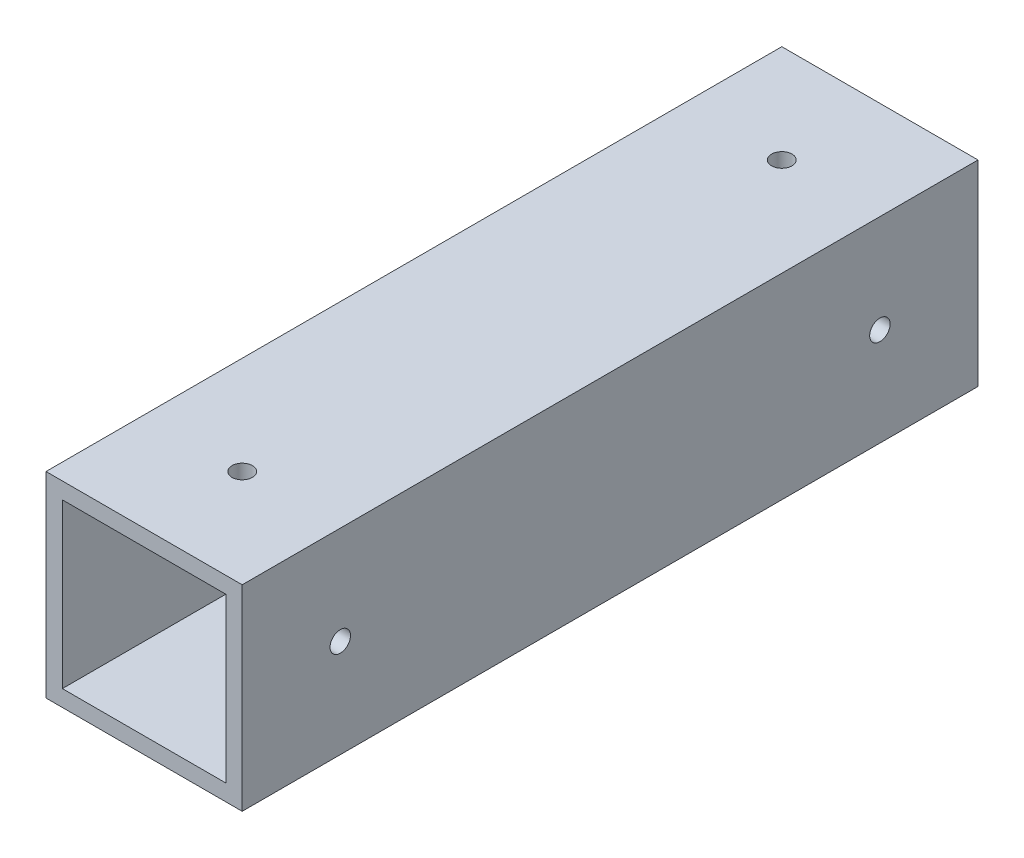
ISO-10303-21;
HEADER;
FILE_DESCRIPTION(('STEP AP214'),'2;1');
FILE_NAME('part.step','',(''),(''),'','','');
FILE_SCHEMA(('AUTOMOTIVE_DESIGN { 1 0 10303 214 1 1 1 1 }'));
ENDSEC;
DATA;
#1=APPLICATION_CONTEXT('core data for automotive mechanical design processes');
#2=APPLICATION_PROTOCOL_DEFINITION('international standard','automotive_design',2000,#1);
#3=PRODUCT_CONTEXT('',#1,'mechanical');
#4=PRODUCT('Part','Part','',(#3));
#5=PRODUCT_RELATED_PRODUCT_CATEGORY('part','',(#4));
#6=PRODUCT_DEFINITION_FORMATION('','',#4);
#7=PRODUCT_DEFINITION_CONTEXT('part definition',#1,'design');
#8=PRODUCT_DEFINITION('design','',#6,#7);
#9=PRODUCT_DEFINITION_SHAPE('','',#8);
#10=(LENGTH_UNIT() NAMED_UNIT(*) SI_UNIT(.MILLI.,.METRE.));
#11=(NAMED_UNIT(*) PLANE_ANGLE_UNIT() SI_UNIT($,.RADIAN.));
#12=(NAMED_UNIT(*) SI_UNIT($,.STERADIAN.) SOLID_ANGLE_UNIT());
#13=UNCERTAINTY_MEASURE_WITH_UNIT(LENGTH_MEASURE(1.E-05),#10,'distance_accuracy_value','');
#14=(GEOMETRIC_REPRESENTATION_CONTEXT(3) GLOBAL_UNCERTAINTY_ASSIGNED_CONTEXT((#13)) GLOBAL_UNIT_ASSIGNED_CONTEXT((#10,
#11,#12)) REPRESENTATION_CONTEXT('',''));
#15=CARTESIAN_POINT('',(0.,0.,0.));
#16=DIRECTION('',(0.,0.,1.));
#17=DIRECTION('',(1.,0.,0.));
#18=AXIS2_PLACEMENT_3D('',#15,#16,#17);
#19=CARTESIAN_POINT('',(0.,0.,45.005));
#20=DIRECTION('',(0.,0.,1.));
#21=DIRECTION('',(1.,0.,0.));
#22=AXIS2_PLACEMENT_3D('',#19,#20,#21);
#23=PLANE('',#22);
#24=DIRECTION('',(0.,-1.,0.));
#25=VECTOR('',#24,1.);
#26=CARTESIAN_POINT('',(-12.,12.,45.005));
#27=LINE('',#26,#25);
#28=CARTESIAN_POINT('',(-12.,12.,45.005));
#29=VERTEX_POINT('',#28);
#30=CARTESIAN_POINT('',(-12.,-12.,45.005));
#31=VERTEX_POINT('',#30);
#32=EDGE_CURVE('E142',#29,#31,#27,.T.);
#33=ORIENTED_EDGE('',*,*,#32,.T.);
#34=DIRECTION('',(1.,0.,0.));
#35=VECTOR('',#34,1.);
#36=CARTESIAN_POINT('',(-12.,-12.,45.005));
#37=LINE('',#36,#35);
#38=CARTESIAN_POINT('',(12.,-12.,45.005));
#39=VERTEX_POINT('',#38);
#40=EDGE_CURVE('E145',#31,#39,#37,.T.);
#41=ORIENTED_EDGE('',*,*,#40,.T.);
#42=DIRECTION('',(0.,1.,0.));
#43=VECTOR('',#42,1.);
#44=CARTESIAN_POINT('',(12.,12.,45.005));
#45=LINE('',#44,#43);
#46=CARTESIAN_POINT('',(12.,12.,45.005));
#47=VERTEX_POINT('',#46);
#48=EDGE_CURVE('E148',#39,#47,#45,.T.);
#49=ORIENTED_EDGE('',*,*,#48,.T.);
#50=DIRECTION('',(-1.,0.,0.));
#51=VECTOR('',#50,1.);
#52=CARTESIAN_POINT('',(-12.,12.,45.005));
#53=LINE('',#52,#51);
#54=EDGE_CURVE('E150',#47,#29,#53,.T.);
#55=ORIENTED_EDGE('',*,*,#54,.T.);
#56=EDGE_LOOP('',(#33,#41,#49,#55));
#57=FACE_BOUND('',#56,.T.);
#58=DIRECTION('',(-1.,0.,0.));
#59=VECTOR('',#58,1.);
#60=CARTESIAN_POINT('',(-10.,10.,45.005));
#61=LINE('',#60,#59);
#62=CARTESIAN_POINT('',(10.,10.,45.005));
#63=VERTEX_POINT('',#62);
#64=CARTESIAN_POINT('',(-10.,10.,45.005));
#65=VERTEX_POINT('',#64);
#66=EDGE_CURVE('E112',#63,#65,#61,.T.);
#67=ORIENTED_EDGE('',*,*,#66,.F.);
#68=DIRECTION('',(0.,1.,0.));
#69=VECTOR('',#68,1.);
#70=CARTESIAN_POINT('',(10.,10.,45.005));
#71=LINE('',#70,#69);
#72=CARTESIAN_POINT('',(10.,-10.,45.005));
#73=VERTEX_POINT('',#72);
#74=EDGE_CURVE('E104',#73,#63,#71,.T.);
#75=ORIENTED_EDGE('',*,*,#74,.F.);
#76=DIRECTION('',(1.,0.,0.));
#77=VECTOR('',#76,1.);
#78=CARTESIAN_POINT('',(-10.,-10.,45.005));
#79=LINE('',#78,#77);
#80=CARTESIAN_POINT('',(-10.,-10.,45.005));
#81=VERTEX_POINT('',#80);
#82=EDGE_CURVE('E126',#81,#73,#79,.T.);
#83=ORIENTED_EDGE('',*,*,#82,.F.);
#84=DIRECTION('',(0.,-1.,0.));
#85=VECTOR('',#84,1.);
#86=CARTESIAN_POINT('',(-10.,10.,45.005));
#87=LINE('',#86,#85);
#88=EDGE_CURVE('E124',#65,#81,#87,.T.);
#89=ORIENTED_EDGE('',*,*,#88,.F.);
#90=EDGE_LOOP('',(#67,#75,#83,#89));
#91=FACE_BOUND('',#90,.T.);
#92=ADVANCED_FACE('F37',(#57,#91),#23,.T.);
#93=CARTESIAN_POINT('',(0.,0.,-45.005));
#94=DIRECTION('',(0.,0.,1.));
#95=DIRECTION('',(1.,0.,0.));
#96=AXIS2_PLACEMENT_3D('',#93,#94,#95);
#97=PLANE('',#96);
#98=DIRECTION('',(0.,-1.,0.));
#99=VECTOR('',#98,1.);
#100=CARTESIAN_POINT('',(-12.,12.,-45.005));
#101=LINE('',#100,#99);
#102=CARTESIAN_POINT('',(-12.,12.,-45.005));
#103=VERTEX_POINT('',#102);
#104=CARTESIAN_POINT('',(-12.,-12.,-45.005));
#105=VERTEX_POINT('',#104);
#106=EDGE_CURVE('E120',#103,#105,#101,.T.);
#107=ORIENTED_EDGE('',*,*,#106,.F.);
#108=DIRECTION('',(-1.,0.,0.));
#109=VECTOR('',#108,1.);
#110=CARTESIAN_POINT('',(-12.,12.,-45.005));
#111=LINE('',#110,#109);
#112=CARTESIAN_POINT('',(12.,12.,-45.005));
#113=VERTEX_POINT('',#112);
#114=EDGE_CURVE('E146',#113,#103,#111,.T.);
#115=ORIENTED_EDGE('',*,*,#114,.F.);
#116=DIRECTION('',(0.,1.,0.));
#117=VECTOR('',#116,1.);
#118=CARTESIAN_POINT('',(12.,12.,-45.005));
#119=LINE('',#118,#117);
#120=CARTESIAN_POINT('',(12.,-12.,-45.005));
#121=VERTEX_POINT('',#120);
#122=EDGE_CURVE('E157',#121,#113,#119,.T.);
#123=ORIENTED_EDGE('',*,*,#122,.F.);
#124=DIRECTION('',(1.,0.,0.));
#125=VECTOR('',#124,1.);
#126=CARTESIAN_POINT('',(-12.,-12.,-45.005));
#127=LINE('',#126,#125);
#128=EDGE_CURVE('E155',#105,#121,#127,.T.);
#129=ORIENTED_EDGE('',*,*,#128,.F.);
#130=EDGE_LOOP('',(#107,#115,#123,#129));
#131=FACE_BOUND('',#130,.T.);
#132=DIRECTION('',(0.,1.,0.));
#133=VECTOR('',#132,1.);
#134=CARTESIAN_POINT('',(10.,10.,-45.005));
#135=LINE('',#134,#133);
#136=CARTESIAN_POINT('',(10.,-10.,-45.005));
#137=VERTEX_POINT('',#136);
#138=CARTESIAN_POINT('',(10.,10.,-45.005));
#139=VERTEX_POINT('',#138);
#140=EDGE_CURVE('E62',#137,#139,#135,.T.);
#141=ORIENTED_EDGE('',*,*,#140,.T.);
#142=DIRECTION('',(-1.,0.,0.));
#143=VECTOR('',#142,1.);
#144=CARTESIAN_POINT('',(-10.,10.,-45.005));
#145=LINE('',#144,#143);
#146=CARTESIAN_POINT('',(-10.,10.,-45.005));
#147=VERTEX_POINT('',#146);
#148=EDGE_CURVE('E119',#139,#147,#145,.T.);
#149=ORIENTED_EDGE('',*,*,#148,.T.);
#150=DIRECTION('',(0.,-1.,0.));
#151=VECTOR('',#150,1.);
#152=CARTESIAN_POINT('',(-10.,10.,-45.005));
#153=LINE('',#152,#151);
#154=CARTESIAN_POINT('',(-10.,-10.,-45.005));
#155=VERTEX_POINT('',#154);
#156=EDGE_CURVE('E134',#147,#155,#153,.T.);
#157=ORIENTED_EDGE('',*,*,#156,.T.);
#158=DIRECTION('',(1.,0.,0.));
#159=VECTOR('',#158,1.);
#160=CARTESIAN_POINT('',(-10.,-10.,-45.005));
#161=LINE('',#160,#159);
#162=EDGE_CURVE('E113',#155,#137,#161,.T.);
#163=ORIENTED_EDGE('',*,*,#162,.T.);
#164=EDGE_LOOP('',(#141,#149,#157,#163));
#165=FACE_BOUND('',#164,.T.);
#166=ADVANCED_FACE('F229',(#131,#165),#97,.F.);
#167=CARTESIAN_POINT('',(-12.,12.,45.005));
#168=DIRECTION('',(1.,0.,0.));
#169=DIRECTION('',(0.,1.,0.));
#170=AXIS2_PLACEMENT_3D('',#167,#168,#169);
#171=PLANE('',#170);
#172=CARTESIAN_POINT('',(-12.,0.,33.005));
#173=DIRECTION('',(-1.,0.,0.));
#174=DIRECTION('',(0.,0.,1.));
#175=AXIS2_PLACEMENT_3D('',#172,#173,#174);
#176=CIRCLE('',#175,1.25);
#177=CARTESIAN_POINT('',(-12.,0.,34.255));
#178=VERTEX_POINT('',#177);
#179=EDGE_CURVE('E182',#178,#178,#176,.T.);
#180=ORIENTED_EDGE('',*,*,#179,.F.);
#181=EDGE_LOOP('',(#180));
#182=FACE_BOUND('',#181,.T.);
#183=CARTESIAN_POINT('',(-12.,0.,-33.005));
#184=DIRECTION('',(-1.,0.,0.));
#185=DIRECTION('',(0.,0.,1.));
#186=AXIS2_PLACEMENT_3D('',#183,#184,#185);
#187=CIRCLE('',#186,1.25);
#188=CARTESIAN_POINT('',(-12.,0.,-31.755));
#189=VERTEX_POINT('',#188);
#190=EDGE_CURVE('E200',#189,#189,#187,.T.);
#191=ORIENTED_EDGE('',*,*,#190,.F.);
#192=EDGE_LOOP('',(#191));
#193=FACE_BOUND('',#192,.T.);
#194=ORIENTED_EDGE('',*,*,#106,.T.);
#195=DIRECTION('',(0.,0.,-1.));
#196=VECTOR('',#195,1.);
#197=CARTESIAN_POINT('',(-12.,-12.,45.005));
#198=LINE('',#197,#196);
#199=EDGE_CURVE('E11',#31,#105,#198,.T.);
#200=ORIENTED_EDGE('',*,*,#199,.F.);
#201=ORIENTED_EDGE('',*,*,#32,.F.);
#202=DIRECTION('',(0.,0.,-1.));
#203=VECTOR('',#202,1.);
#204=CARTESIAN_POINT('',(-12.,12.,45.005));
#205=LINE('',#204,#203);
#206=EDGE_CURVE('E152',#29,#103,#205,.T.);
#207=ORIENTED_EDGE('',*,*,#206,.T.);
#208=EDGE_LOOP('',(#194,#200,#201,#207));
#209=FACE_BOUND('',#208,.T.);
#210=ADVANCED_FACE('F39',(#182,#193,#209),#171,.F.);
#211=CARTESIAN_POINT('',(-12.,-12.,45.005));
#212=DIRECTION('',(0.,1.,0.));
#213=DIRECTION('',(-1.,0.,0.));
#214=AXIS2_PLACEMENT_3D('',#211,#212,#213);
#215=PLANE('',#214);
#216=CARTESIAN_POINT('',(0.,-12.,33.005));
#217=DIRECTION('',(0.,1.,0.));
#218=DIRECTION('',(0.,0.,1.));
#219=AXIS2_PLACEMENT_3D('',#216,#217,#218);
#220=CIRCLE('',#219,1.24999999999998);
#221=CARTESIAN_POINT('',(0.,-12.,34.255));
#222=VERTEX_POINT('',#221);
#223=EDGE_CURVE('E248',#222,#222,#220,.T.);
#224=ORIENTED_EDGE('',*,*,#223,.T.);
#225=EDGE_LOOP('',(#224));
#226=FACE_BOUND('',#225,.T.);
#227=CARTESIAN_POINT('',(0.,-12.,-33.005));
#228=DIRECTION('',(0.,1.,0.));
#229=DIRECTION('',(0.,0.,1.));
#230=AXIS2_PLACEMENT_3D('',#227,#228,#229);
#231=CIRCLE('',#230,1.24999999999998);
#232=CARTESIAN_POINT('',(0.,-12.,-31.755));
#233=VERTEX_POINT('',#232);
#234=EDGE_CURVE('E178',#233,#233,#231,.T.);
#235=ORIENTED_EDGE('',*,*,#234,.T.);
#236=EDGE_LOOP('',(#235));
#237=FACE_BOUND('',#236,.T.);
#238=ORIENTED_EDGE('',*,*,#128,.T.);
#239=DIRECTION('',(0.,0.,-1.));
#240=VECTOR('',#239,1.);
#241=CARTESIAN_POINT('',(12.,-12.,45.005));
#242=LINE('',#241,#240);
#243=EDGE_CURVE('E46',#39,#121,#242,.T.);
#244=ORIENTED_EDGE('',*,*,#243,.F.);
#245=ORIENTED_EDGE('',*,*,#40,.F.);
#246=ORIENTED_EDGE('',*,*,#199,.T.);
#247=EDGE_LOOP('',(#238,#244,#245,#246));
#248=FACE_BOUND('',#247,.T.);
#249=ADVANCED_FACE('F237',(#226,#237,#248),#215,.F.);
#250=CARTESIAN_POINT('',(12.,12.,45.005));
#251=DIRECTION('',(-1.,0.,0.));
#252=DIRECTION('',(0.,-1.,0.));
#253=AXIS2_PLACEMENT_3D('',#250,#251,#252);
#254=PLANE('',#253);
#255=CARTESIAN_POINT('',(12.,0.,33.005));
#256=DIRECTION('',(-1.,0.,0.));
#257=DIRECTION('',(0.,0.,1.));
#258=AXIS2_PLACEMENT_3D('',#255,#256,#257);
#259=CIRCLE('',#258,1.24999999999999);
#260=CARTESIAN_POINT('',(12.,0.,34.255));
#261=VERTEX_POINT('',#260);
#262=EDGE_CURVE('E174',#261,#261,#259,.T.);
#263=ORIENTED_EDGE('',*,*,#262,.T.);
#264=EDGE_LOOP('',(#263));
#265=FACE_BOUND('',#264,.T.);
#266=CARTESIAN_POINT('',(12.,0.,-33.005));
#267=DIRECTION('',(-1.,0.,0.));
#268=DIRECTION('',(0.,0.,1.));
#269=AXIS2_PLACEMENT_3D('',#266,#267,#268);
#270=CIRCLE('',#269,1.24999999999999);
#271=CARTESIAN_POINT('',(12.,0.,-31.755));
#272=VERTEX_POINT('',#271);
#273=EDGE_CURVE('E170',#272,#272,#270,.T.);
#274=ORIENTED_EDGE('',*,*,#273,.T.);
#275=EDGE_LOOP('',(#274));
#276=FACE_BOUND('',#275,.T.);
#277=ORIENTED_EDGE('',*,*,#122,.T.);
#278=DIRECTION('',(0.,0.,-1.));
#279=VECTOR('',#278,1.);
#280=CARTESIAN_POINT('',(12.,12.,45.005));
#281=LINE('',#280,#279);
#282=EDGE_CURVE('E162',#47,#113,#281,.T.);
#283=ORIENTED_EDGE('',*,*,#282,.F.);
#284=ORIENTED_EDGE('',*,*,#48,.F.);
#285=ORIENTED_EDGE('',*,*,#243,.T.);
#286=EDGE_LOOP('',(#277,#283,#284,#285));
#287=FACE_BOUND('',#286,.T.);
#288=ADVANCED_FACE('F223',(#265,#276,#287),#254,.F.);
#289=CARTESIAN_POINT('',(-12.,12.,45.005));
#290=DIRECTION('',(0.,-1.,0.));
#291=DIRECTION('',(0.,0.,-1.));
#292=AXIS2_PLACEMENT_3D('',#289,#290,#291);
#293=PLANE('',#292);
#294=CARTESIAN_POINT('',(0.,12.,33.005));
#295=DIRECTION('',(0.,1.,0.));
#296=DIRECTION('',(0.,0.,1.));
#297=AXIS2_PLACEMENT_3D('',#294,#295,#296);
#298=CIRCLE('',#297,1.24999999999999);
#299=CARTESIAN_POINT('',(0.,12.,34.255));
#300=VERTEX_POINT('',#299);
#301=EDGE_CURVE('E301',#300,#300,#298,.T.);
#302=ORIENTED_EDGE('',*,*,#301,.F.);
#303=EDGE_LOOP('',(#302));
#304=FACE_BOUND('',#303,.T.);
#305=CARTESIAN_POINT('',(0.,12.,-33.005));
#306=DIRECTION('',(0.,1.,0.));
#307=DIRECTION('',(0.,0.,1.));
#308=AXIS2_PLACEMENT_3D('',#305,#306,#307);
#309=CIRCLE('',#308,1.24999999999999);
#310=CARTESIAN_POINT('',(0.,12.,-31.755));
#311=VERTEX_POINT('',#310);
#312=EDGE_CURVE('E185',#311,#311,#309,.T.);
#313=ORIENTED_EDGE('',*,*,#312,.F.);
#314=EDGE_LOOP('',(#313));
#315=FACE_BOUND('',#314,.T.);
#316=ORIENTED_EDGE('',*,*,#114,.T.);
#317=ORIENTED_EDGE('',*,*,#206,.F.);
#318=ORIENTED_EDGE('',*,*,#54,.F.);
#319=ORIENTED_EDGE('',*,*,#282,.T.);
#320=EDGE_LOOP('',(#316,#317,#318,#319));
#321=FACE_BOUND('',#320,.T.);
#322=ADVANCED_FACE('F211',(#304,#315,#321),#293,.F.);
#323=CARTESIAN_POINT('',(10.,10.,45.005));
#324=DIRECTION('',(-1.,0.,0.));
#325=DIRECTION('',(0.,0.,1.));
#326=AXIS2_PLACEMENT_3D('',#323,#324,#325);
#327=PLANE('',#326);
#328=CARTESIAN_POINT('',(10.,0.,33.005));
#329=DIRECTION('',(-1.,0.,0.));
#330=DIRECTION('',(0.,0.,1.));
#331=AXIS2_PLACEMENT_3D('',#328,#329,#330);
#332=CIRCLE('',#331,1.25);
#333=CARTESIAN_POINT('',(10.,0.,34.255));
#334=VERTEX_POINT('',#333);
#335=EDGE_CURVE('E173',#334,#334,#332,.T.);
#336=ORIENTED_EDGE('',*,*,#335,.F.);
#337=EDGE_LOOP('',(#336));
#338=FACE_BOUND('',#337,.T.);
#339=CARTESIAN_POINT('',(10.,0.,-33.005));
#340=DIRECTION('',(-1.,0.,0.));
#341=DIRECTION('',(0.,0.,1.));
#342=AXIS2_PLACEMENT_3D('',#339,#340,#341);
#343=CIRCLE('',#342,1.25);
#344=CARTESIAN_POINT('',(10.,0.,-31.755));
#345=VERTEX_POINT('',#344);
#346=EDGE_CURVE('E132',#345,#345,#343,.T.);
#347=ORIENTED_EDGE('',*,*,#346,.F.);
#348=EDGE_LOOP('',(#347));
#349=FACE_BOUND('',#348,.T.);
#350=ORIENTED_EDGE('',*,*,#140,.F.);
#351=DIRECTION('',(0.,0.,-1.));
#352=VECTOR('',#351,1.);
#353=CARTESIAN_POINT('',(10.,-10.,45.005));
#354=LINE('',#353,#352);
#355=EDGE_CURVE('E108',#73,#137,#354,.T.);
#356=ORIENTED_EDGE('',*,*,#355,.F.);
#357=ORIENTED_EDGE('',*,*,#74,.T.);
#358=DIRECTION('',(0.,0.,-1.));
#359=VECTOR('',#358,1.);
#360=CARTESIAN_POINT('',(10.,10.,45.005));
#361=LINE('',#360,#359);
#362=EDGE_CURVE('E107',#63,#139,#361,.T.);
#363=ORIENTED_EDGE('',*,*,#362,.T.);
#364=EDGE_LOOP('',(#350,#356,#357,#363));
#365=FACE_BOUND('',#364,.T.);
#366=ADVANCED_FACE('F106',(#338,#349,#365),#327,.T.);
#367=CARTESIAN_POINT('',(-10.,10.,45.005));
#368=DIRECTION('',(0.,-1.,0.));
#369=DIRECTION('',(0.,0.,-1.));
#370=AXIS2_PLACEMENT_3D('',#367,#368,#369);
#371=PLANE('',#370);
#372=CARTESIAN_POINT('',(0.,10.,33.005));
#373=DIRECTION('',(0.,-1.,0.));
#374=DIRECTION('',(0.,0.,-1.));
#375=AXIS2_PLACEMENT_3D('',#372,#373,#374);
#376=CIRCLE('',#375,1.24999999999999);
#377=CARTESIAN_POINT('',(0.,10.,31.755));
#378=VERTEX_POINT('',#377);
#379=EDGE_CURVE('E190',#378,#378,#376,.T.);
#380=ORIENTED_EDGE('',*,*,#379,.F.);
#381=EDGE_LOOP('',(#380));
#382=FACE_BOUND('',#381,.T.);
#383=CARTESIAN_POINT('',(0.,10.,-33.005));
#384=DIRECTION('',(0.,-1.,0.));
#385=DIRECTION('',(0.,0.,-1.));
#386=AXIS2_PLACEMENT_3D('',#383,#384,#385);
#387=CIRCLE('',#386,1.24999999999999);
#388=CARTESIAN_POINT('',(0.,10.,-34.255));
#389=VERTEX_POINT('',#388);
#390=EDGE_CURVE('E177',#389,#389,#387,.T.);
#391=ORIENTED_EDGE('',*,*,#390,.F.);
#392=EDGE_LOOP('',(#391));
#393=FACE_BOUND('',#392,.T.);
#394=ORIENTED_EDGE('',*,*,#148,.F.);
#395=ORIENTED_EDGE('',*,*,#362,.F.);
#396=ORIENTED_EDGE('',*,*,#66,.T.);
#397=DIRECTION('',(0.,0.,-1.));
#398=VECTOR('',#397,1.);
#399=CARTESIAN_POINT('',(-10.,10.,45.005));
#400=LINE('',#399,#398);
#401=EDGE_CURVE('E121',#65,#147,#400,.T.);
#402=ORIENTED_EDGE('',*,*,#401,.T.);
#403=EDGE_LOOP('',(#394,#395,#396,#402));
#404=FACE_BOUND('',#403,.T.);
#405=ADVANCED_FACE('F116',(#382,#393,#404),#371,.T.);
#406=CARTESIAN_POINT('',(-10.,10.,45.005));
#407=DIRECTION('',(1.,0.,0.));
#408=DIRECTION('',(0.,1.,0.));
#409=AXIS2_PLACEMENT_3D('',#406,#407,#408);
#410=PLANE('',#409);
#411=CARTESIAN_POINT('',(-10.,0.,33.005));
#412=DIRECTION('',(1.,0.,0.));
#413=DIRECTION('',(0.,1.,0.));
#414=AXIS2_PLACEMENT_3D('',#411,#412,#413);
#415=CIRCLE('',#414,1.25);
#416=CARTESIAN_POINT('',(-10.,1.24999999999999,33.005));
#417=VERTEX_POINT('',#416);
#418=EDGE_CURVE('E171',#417,#417,#415,.T.);
#419=ORIENTED_EDGE('',*,*,#418,.F.);
#420=EDGE_LOOP('',(#419));
#421=FACE_BOUND('',#420,.T.);
#422=CARTESIAN_POINT('',(-10.,0.,-33.005));
#423=DIRECTION('',(1.,0.,0.));
#424=DIRECTION('',(0.,1.,0.));
#425=AXIS2_PLACEMENT_3D('',#422,#423,#424);
#426=CIRCLE('',#425,1.25);
#427=CARTESIAN_POINT('',(-10.,1.24999999999999,-33.005));
#428=VERTEX_POINT('',#427);
#429=EDGE_CURVE('E167',#428,#428,#426,.T.);
#430=ORIENTED_EDGE('',*,*,#429,.F.);
#431=EDGE_LOOP('',(#430));
#432=FACE_BOUND('',#431,.T.);
#433=ORIENTED_EDGE('',*,*,#156,.F.);
#434=ORIENTED_EDGE('',*,*,#401,.F.);
#435=ORIENTED_EDGE('',*,*,#88,.T.);
#436=DIRECTION('',(0.,0.,-1.));
#437=VECTOR('',#436,1.);
#438=CARTESIAN_POINT('',(-10.,-10.,45.005));
#439=LINE('',#438,#437);
#440=EDGE_CURVE('E54',#81,#155,#439,.T.);
#441=ORIENTED_EDGE('',*,*,#440,.T.);
#442=EDGE_LOOP('',(#433,#434,#435,#441));
#443=FACE_BOUND('',#442,.T.);
#444=ADVANCED_FACE('F219',(#421,#432,#443),#410,.T.);
#445=CARTESIAN_POINT('',(-10.,-10.,45.005));
#446=DIRECTION('',(0.,1.,0.));
#447=DIRECTION('',(0.,0.,1.));
#448=AXIS2_PLACEMENT_3D('',#445,#446,#447);
#449=PLANE('',#448);
#450=CARTESIAN_POINT('',(0.,-10.,33.005));
#451=DIRECTION('',(0.,1.,0.));
#452=DIRECTION('',(0.,0.,1.));
#453=AXIS2_PLACEMENT_3D('',#450,#451,#452);
#454=CIRCLE('',#453,1.24999999999999);
#455=CARTESIAN_POINT('',(0.,-10.,34.255));
#456=VERTEX_POINT('',#455);
#457=EDGE_CURVE('E41',#456,#456,#454,.T.);
#458=ORIENTED_EDGE('',*,*,#457,.F.);
#459=EDGE_LOOP('',(#458));
#460=FACE_BOUND('',#459,.T.);
#461=CARTESIAN_POINT('',(0.,-10.,-33.005));
#462=DIRECTION('',(0.,1.,0.));
#463=DIRECTION('',(0.,0.,1.));
#464=AXIS2_PLACEMENT_3D('',#461,#462,#463);
#465=CIRCLE('',#464,1.24999999999999);
#466=CARTESIAN_POINT('',(0.,-10.,-31.755));
#467=VERTEX_POINT('',#466);
#468=EDGE_CURVE('E175',#467,#467,#465,.T.);
#469=ORIENTED_EDGE('',*,*,#468,.F.);
#470=EDGE_LOOP('',(#469));
#471=FACE_BOUND('',#470,.T.);
#472=ORIENTED_EDGE('',*,*,#162,.F.);
#473=ORIENTED_EDGE('',*,*,#440,.F.);
#474=ORIENTED_EDGE('',*,*,#82,.T.);
#475=ORIENTED_EDGE('',*,*,#355,.T.);
#476=EDGE_LOOP('',(#472,#473,#474,#475));
#477=FACE_BOUND('',#476,.T.);
#478=ADVANCED_FACE('F265',(#460,#471,#477),#449,.T.);
#479=CARTESIAN_POINT('',(-12.,0.,-33.005));
#480=DIRECTION('',(-1.,0.,0.));
#481=DIRECTION('',(0.,0.,1.));
#482=AXIS2_PLACEMENT_3D('',#479,#480,#481);
#483=CYLINDRICAL_SURFACE('',#482,1.25);
#484=ORIENTED_EDGE('',*,*,#429,.T.);
#485=EDGE_LOOP('',(#484));
#486=FACE_BOUND('',#485,.T.);
#487=ORIENTED_EDGE('',*,*,#190,.T.);
#488=EDGE_LOOP('',(#487));
#489=FACE_BOUND('',#488,.T.);
#490=ADVANCED_FACE('F267',(#486,#489),#483,.F.);
#491=ORIENTED_EDGE('',*,*,#346,.T.);
#492=EDGE_LOOP('',(#491));
#493=FACE_BOUND('',#492,.T.);
#494=ORIENTED_EDGE('',*,*,#273,.F.);
#495=EDGE_LOOP('',(#494));
#496=FACE_BOUND('',#495,.T.);
#497=ADVANCED_FACE('F207',(#493,#496),#483,.F.);
#498=CARTESIAN_POINT('',(-12.,0.,33.005));
#499=DIRECTION('',(-1.,0.,0.));
#500=DIRECTION('',(0.,0.,1.));
#501=AXIS2_PLACEMENT_3D('',#498,#499,#500);
#502=CYLINDRICAL_SURFACE('',#501,1.25);
#503=ORIENTED_EDGE('',*,*,#418,.T.);
#504=EDGE_LOOP('',(#503));
#505=FACE_BOUND('',#504,.T.);
#506=ORIENTED_EDGE('',*,*,#179,.T.);
#507=EDGE_LOOP('',(#506));
#508=FACE_BOUND('',#507,.T.);
#509=ADVANCED_FACE('F281',(#505,#508),#502,.F.);
#510=ORIENTED_EDGE('',*,*,#335,.T.);
#511=EDGE_LOOP('',(#510));
#512=FACE_BOUND('',#511,.T.);
#513=ORIENTED_EDGE('',*,*,#262,.F.);
#514=EDGE_LOOP('',(#513));
#515=FACE_BOUND('',#514,.T.);
#516=ADVANCED_FACE('F284',(#512,#515),#502,.F.);
#517=CARTESIAN_POINT('',(0.,12.,-33.005));
#518=DIRECTION('',(0.,1.,0.));
#519=DIRECTION('',(0.,0.,1.));
#520=AXIS2_PLACEMENT_3D('',#517,#518,#519);
#521=CYLINDRICAL_SURFACE('',#520,1.24999999999999);
#522=ORIENTED_EDGE('',*,*,#468,.T.);
#523=EDGE_LOOP('',(#522));
#524=FACE_BOUND('',#523,.T.);
#525=ORIENTED_EDGE('',*,*,#234,.F.);
#526=EDGE_LOOP('',(#525));
#527=FACE_BOUND('',#526,.T.);
#528=ADVANCED_FACE('F286',(#524,#527),#521,.F.);
#529=ORIENTED_EDGE('',*,*,#390,.T.);
#530=EDGE_LOOP('',(#529));
#531=FACE_BOUND('',#530,.T.);
#532=ORIENTED_EDGE('',*,*,#312,.T.);
#533=EDGE_LOOP('',(#532));
#534=FACE_BOUND('',#533,.T.);
#535=ADVANCED_FACE('F289',(#531,#534),#521,.F.);
#536=CARTESIAN_POINT('',(0.,12.,33.005));
#537=DIRECTION('',(0.,1.,0.));
#538=DIRECTION('',(0.,0.,1.));
#539=AXIS2_PLACEMENT_3D('',#536,#537,#538);
#540=CYLINDRICAL_SURFACE('',#539,1.24999999999999);
#541=ORIENTED_EDGE('',*,*,#457,.T.);
#542=EDGE_LOOP('',(#541));
#543=FACE_BOUND('',#542,.T.);
#544=ORIENTED_EDGE('',*,*,#223,.F.);
#545=EDGE_LOOP('',(#544));
#546=FACE_BOUND('',#545,.T.);
#547=ADVANCED_FACE('F290',(#543,#546),#540,.F.);
#548=ORIENTED_EDGE('',*,*,#379,.T.);
#549=EDGE_LOOP('',(#548));
#550=FACE_BOUND('',#549,.T.);
#551=ORIENTED_EDGE('',*,*,#301,.T.);
#552=EDGE_LOOP('',(#551));
#553=FACE_BOUND('',#552,.T.);
#554=ADVANCED_FACE('F292',(#550,#553),#540,.F.);
#555=CLOSED_SHELL('',(#92,#166,#210,#249,#288,#322,#366,#405,#444,#478,#490,#497,#509,#516,#528,
#535,#547,#554));
#556=MANIFOLD_SOLID_BREP('B2',#555);
#557=ADVANCED_BREP_SHAPE_REPRESENTATION('',(#18,#556),#14);
#558=SHAPE_DEFINITION_REPRESENTATION(#9,#557);
ENDSEC;
END-ISO-10303-21;
